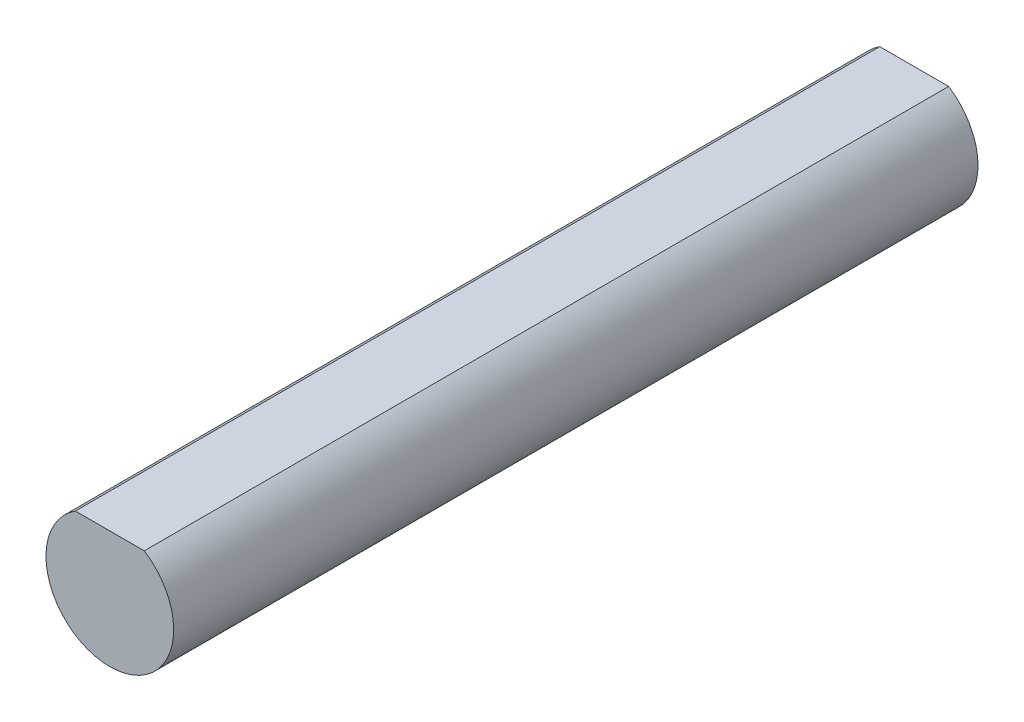
ISO-10303-21;
HEADER;
FILE_DESCRIPTION(('STEP AP214'),'2;1');
FILE_NAME('part.step','',(''),(''),'','','');
FILE_SCHEMA(('AUTOMOTIVE_DESIGN { 1 0 10303 214 1 1 1 1 }'));
ENDSEC;
DATA;
#1=APPLICATION_CONTEXT('core data for automotive mechanical design processes');
#2=APPLICATION_PROTOCOL_DEFINITION('international standard','automotive_design',2000,#1);
#3=PRODUCT_CONTEXT('',#1,'mechanical');
#4=PRODUCT('Part','Part','',(#3));
#5=PRODUCT_RELATED_PRODUCT_CATEGORY('part','',(#4));
#6=PRODUCT_DEFINITION_FORMATION('','',#4);
#7=PRODUCT_DEFINITION_CONTEXT('part definition',#1,'design');
#8=PRODUCT_DEFINITION('design','',#6,#7);
#9=PRODUCT_DEFINITION_SHAPE('','',#8);
#10=(LENGTH_UNIT() NAMED_UNIT(*) SI_UNIT(.MILLI.,.METRE.));
#11=(NAMED_UNIT(*) PLANE_ANGLE_UNIT() SI_UNIT($,.RADIAN.));
#12=(NAMED_UNIT(*) SI_UNIT($,.STERADIAN.) SOLID_ANGLE_UNIT());
#13=UNCERTAINTY_MEASURE_WITH_UNIT(LENGTH_MEASURE(1.E-05),#10,'distance_accuracy_value','');
#14=(GEOMETRIC_REPRESENTATION_CONTEXT(3) GLOBAL_UNCERTAINTY_ASSIGNED_CONTEXT((#13)) GLOBAL_UNIT_ASSIGNED_CONTEXT((#10,
#11,#12)) REPRESENTATION_CONTEXT('',''));
#15=CARTESIAN_POINT('',(0.,0.,0.));
#16=DIRECTION('',(0.,0.,1.));
#17=DIRECTION('',(1.,0.,0.));
#18=AXIS2_PLACEMENT_3D('',#15,#16,#17);
#19=CARTESIAN_POINT('',(0.,0.,40.));
#20=DIRECTION('',(0.,0.,-1.));
#21=DIRECTION('',(-1.,0.,0.));
#22=AXIS2_PLACEMENT_3D('',#19,#20,#21);
#23=CYLINDRICAL_SURFACE('',#22,3.175);
#24=CARTESIAN_POINT('',(0.,0.,0.));
#25=DIRECTION('',(0.,0.,1.));
#26=DIRECTION('',(1.,0.,0.));
#27=AXIS2_PLACEMENT_3D('',#24,#25,#26);
#28=CIRCLE('',#27,3.175);
#29=CARTESIAN_POINT('',(-1.7145,2.6722864273876,0.));
#30=VERTEX_POINT('',#29);
#31=CARTESIAN_POINT('',(1.7145,2.6722864273876,0.));
#32=VERTEX_POINT('',#31);
#33=EDGE_CURVE('E76',#30,#32,#28,.T.);
#34=ORIENTED_EDGE('',*,*,#33,.T.);
#35=DIRECTION('',(0.,0.,-1.));
#36=VECTOR('',#35,1.);
#37=CARTESIAN_POINT('',(1.7145,2.6722864273876,40.));
#38=LINE('',#37,#36);
#39=CARTESIAN_POINT('',(1.7145,2.6722864273876,40.));
#40=VERTEX_POINT('',#39);
#41=EDGE_CURVE('E11',#40,#32,#38,.T.);
#42=ORIENTED_EDGE('',*,*,#41,.F.);
#43=CARTESIAN_POINT('',(0.,0.,40.));
#44=DIRECTION('',(0.,0.,1.));
#45=DIRECTION('',(1.,0.,0.));
#46=AXIS2_PLACEMENT_3D('',#43,#44,#45);
#47=CIRCLE('',#46,3.175);
#48=CARTESIAN_POINT('',(-1.7145,2.6722864273876,40.));
#49=VERTEX_POINT('',#48);
#50=EDGE_CURVE('E75',#49,#40,#47,.T.);
#51=ORIENTED_EDGE('',*,*,#50,.F.);
#52=DIRECTION('',(0.,0.,-1.));
#53=VECTOR('',#52,1.);
#54=CARTESIAN_POINT('',(-1.7145,2.6722864273876,40.));
#55=LINE('',#54,#53);
#56=EDGE_CURVE('E52',#49,#30,#55,.T.);
#57=ORIENTED_EDGE('',*,*,#56,.T.);
#58=EDGE_LOOP('',(#34,#42,#51,#57));
#59=FACE_BOUND('',#58,.T.);
#60=ADVANCED_FACE('F43',(#59),#23,.T.);
#61=CARTESIAN_POINT('',(-1.7145,2.6722864273876,40.));
#62=DIRECTION('',(0.,-1.,0.));
#63=DIRECTION('',(0.,0.,-1.));
#64=AXIS2_PLACEMENT_3D('',#61,#62,#63);
#65=PLANE('',#64);
#66=DIRECTION('',(-1.,0.,0.));
#67=VECTOR('',#66,1.);
#68=CARTESIAN_POINT('',(-1.7145,2.6722864273876,0.));
#69=LINE('',#68,#67);
#70=EDGE_CURVE('E67',#32,#30,#69,.T.);
#71=ORIENTED_EDGE('',*,*,#70,.T.);
#72=ORIENTED_EDGE('',*,*,#56,.F.);
#73=DIRECTION('',(-1.,0.,0.));
#74=VECTOR('',#73,1.);
#75=CARTESIAN_POINT('',(-1.7145,2.6722864273876,40.));
#76=LINE('',#75,#74);
#77=EDGE_CURVE('E59',#40,#49,#76,.T.);
#78=ORIENTED_EDGE('',*,*,#77,.F.);
#79=ORIENTED_EDGE('',*,*,#41,.T.);
#80=EDGE_LOOP('',(#71,#72,#78,#79));
#81=FACE_BOUND('',#80,.T.);
#82=ADVANCED_FACE('F70',(#81),#65,.F.);
#83=CARTESIAN_POINT('',(0.,0.,40.));
#84=DIRECTION('',(0.,0.,1.));
#85=DIRECTION('',(1.,0.,0.));
#86=AXIS2_PLACEMENT_3D('',#83,#84,#85);
#87=PLANE('',#86);
#88=ORIENTED_EDGE('',*,*,#50,.T.);
#89=ORIENTED_EDGE('',*,*,#77,.T.);
#90=EDGE_LOOP('',(#88,#89));
#91=FACE_BOUND('',#90,.T.);
#92=ADVANCED_FACE('F87',(#91),#87,.T.);
#93=CARTESIAN_POINT('',(0.,0.,0.));
#94=DIRECTION('',(0.,0.,1.));
#95=DIRECTION('',(1.,0.,0.));
#96=AXIS2_PLACEMENT_3D('',#93,#94,#95);
#97=PLANE('',#96);
#98=ORIENTED_EDGE('',*,*,#33,.F.);
#99=ORIENTED_EDGE('',*,*,#70,.F.);
#100=EDGE_LOOP('',(#98,#99));
#101=FACE_BOUND('',#100,.T.);
#102=ADVANCED_FACE('F80',(#101),#97,.F.);
#103=CLOSED_SHELL('',(#60,#82,#92,#102));
#104=MANIFOLD_SOLID_BREP('B2',#103);
#105=ADVANCED_BREP_SHAPE_REPRESENTATION('',(#18,#104),#14);
#106=SHAPE_DEFINITION_REPRESENTATION(#9,#105);
ENDSEC;
END-ISO-10303-21;
